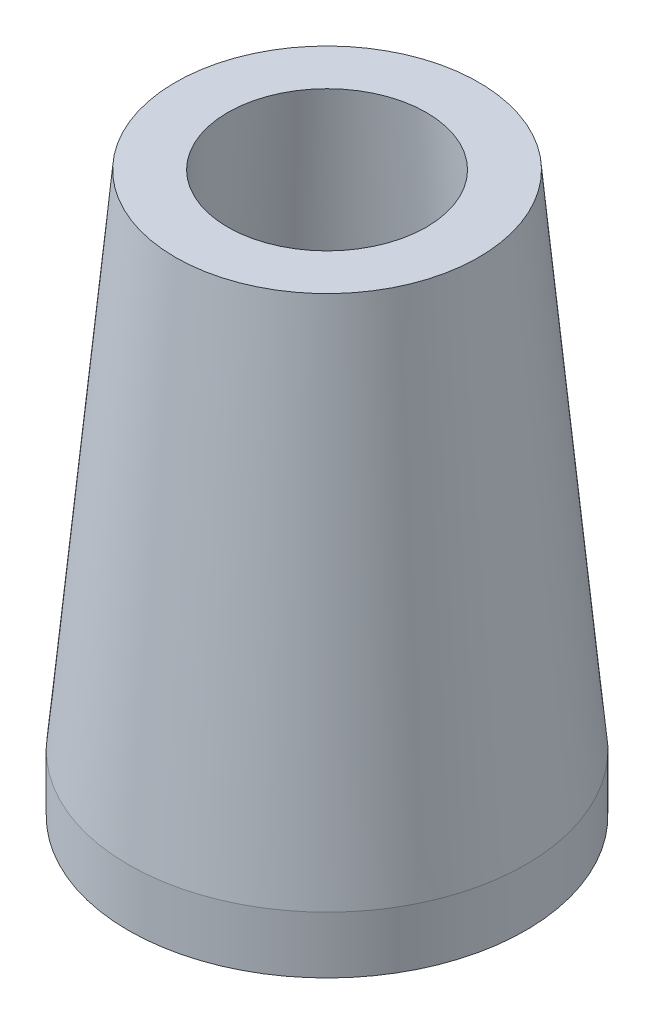
ISO-10303-21;
HEADER;
FILE_DESCRIPTION(('STEP AP214'),'2;1');
FILE_NAME('part.step','',(''),(''),'','','');
FILE_SCHEMA(('AUTOMOTIVE_DESIGN { 1 0 10303 214 1 1 1 1 }'));
ENDSEC;
DATA;
#1=APPLICATION_CONTEXT('core data for automotive mechanical design processes');
#2=APPLICATION_PROTOCOL_DEFINITION('international standard','automotive_design',2000,#1);
#3=PRODUCT_CONTEXT('',#1,'mechanical');
#4=PRODUCT('Part','Part','',(#3));
#5=PRODUCT_RELATED_PRODUCT_CATEGORY('part','',(#4));
#6=PRODUCT_DEFINITION_FORMATION('','',#4);
#7=PRODUCT_DEFINITION_CONTEXT('part definition',#1,'design');
#8=PRODUCT_DEFINITION('design','',#6,#7);
#9=PRODUCT_DEFINITION_SHAPE('','',#8);
#10=(LENGTH_UNIT() NAMED_UNIT(*) SI_UNIT(.MILLI.,.METRE.));
#11=(NAMED_UNIT(*) PLANE_ANGLE_UNIT() SI_UNIT($,.RADIAN.));
#12=(NAMED_UNIT(*) SI_UNIT($,.STERADIAN.) SOLID_ANGLE_UNIT());
#13=UNCERTAINTY_MEASURE_WITH_UNIT(LENGTH_MEASURE(1.E-05),#10,'distance_accuracy_value','');
#14=(GEOMETRIC_REPRESENTATION_CONTEXT(3) GLOBAL_UNCERTAINTY_ASSIGNED_CONTEXT((#13)) GLOBAL_UNIT_ASSIGNED_CONTEXT((#10,
#11,#12)) REPRESENTATION_CONTEXT('',''));
#15=CARTESIAN_POINT('',(0.,0.,0.));
#16=DIRECTION('',(0.,0.,1.));
#17=DIRECTION('',(1.,0.,0.));
#18=AXIS2_PLACEMENT_3D('',#15,#16,#17);
#19=CARTESIAN_POINT('',(452.999168680417,301.998778729753,0.));
#20=DIRECTION('',(0.,1.,0.));
#21=DIRECTION('',(0.,0.,1.));
#22=AXIS2_PLACEMENT_3D('',#19,#20,#21);
#23=PLANE('',#22);
#24=CARTESIAN_POINT('',(471.999750168189,301.998778729753,0.));
#25=DIRECTION('',(0.,1.,0.));
#26=DIRECTION('',(0.,0.,1.));
#27=AXIS2_PLACEMENT_3D('',#24,#25,#26);
#28=CIRCLE('',#27,29.0005814877719);
#29=CARTESIAN_POINT('',(471.999750168189,301.998778729753,29.0005814877719));
#30=VERTEX_POINT('',#29);
#31=EDGE_CURVE('E74',#30,#30,#28,.T.);
#32=ORIENTED_EDGE('',*,*,#31,.T.);
#33=EDGE_LOOP('',(#32));
#34=FACE_BOUND('',#33,.T.);
#35=CARTESIAN_POINT('',(471.999750168189,301.998778729753,0.));
#36=DIRECTION('',(0.,1.,0.));
#37=DIRECTION('',(0.,0.,1.));
#38=AXIS2_PLACEMENT_3D('',#35,#36,#37);
#39=CIRCLE('',#38,19.0005814877719);
#40=CARTESIAN_POINT('',(471.999750168189,301.998778729753,19.0005814877719));
#41=VERTEX_POINT('',#40);
#42=EDGE_CURVE('E10',#41,#41,#39,.T.);
#43=ORIENTED_EDGE('',*,*,#42,.F.);
#44=EDGE_LOOP('',(#43));
#45=FACE_BOUND('',#44,.T.);
#46=ADVANCED_FACE('F43',(#34,#45),#23,.T.);
#47=CARTESIAN_POINT('',(471.999750168189,301.998778729753,0.));
#48=DIRECTION('',(0.,-1.,0.));
#49=DIRECTION('',(0.,0.,-1.));
#50=AXIS2_PLACEMENT_3D('',#47,#48,#49);
#51=CONICAL_SURFACE('',#50,19.0005814877719,0.0739338318093924);
#52=CARTESIAN_POINT('',(471.999750168189,204.999945769809,0.));
#53=DIRECTION('',(0.,1.,0.));
#54=DIRECTION('',(0.,0.,1.));
#55=AXIS2_PLACEMENT_3D('',#52,#53,#54);
#56=CIRCLE('',#55,26.1851724938013);
#57=CARTESIAN_POINT('',(471.999750168189,204.999945769809,26.1851724938013));
#58=VERTEX_POINT('',#57);
#59=EDGE_CURVE('E50',#58,#58,#56,.T.);
#60=ORIENTED_EDGE('',*,*,#59,.F.);
#61=EDGE_LOOP('',(#60));
#62=FACE_BOUND('',#61,.T.);
#63=ORIENTED_EDGE('',*,*,#42,.T.);
#64=EDGE_LOOP('',(#63));
#65=FACE_BOUND('',#64,.T.);
#66=ADVANCED_FACE('F93',(#62,#65),#51,.F.);
#67=CARTESIAN_POINT('',(445.814577674387,204.999945769809,0.));
#68=DIRECTION('',(0.,1.,0.));
#69=DIRECTION('',(0.,0.,1.));
#70=AXIS2_PLACEMENT_3D('',#67,#68,#69);
#71=PLANE('',#70);
#72=CARTESIAN_POINT('',(471.999750168189,204.999945769809,0.));
#73=DIRECTION('',(0.,1.,0.));
#74=DIRECTION('',(0.,0.,1.));
#75=AXIS2_PLACEMENT_3D('',#72,#73,#74);
#76=CIRCLE('',#75,27.9815084844066);
#77=CARTESIAN_POINT('',(471.999750168189,204.999945769809,27.9815084844066));
#78=VERTEX_POINT('',#77);
#79=EDGE_CURVE('E55',#78,#78,#76,.T.);
#80=ORIENTED_EDGE('',*,*,#79,.F.);
#81=EDGE_LOOP('',(#80));
#82=FACE_BOUND('',#81,.T.);
#83=ORIENTED_EDGE('',*,*,#59,.T.);
#84=EDGE_LOOP('',(#83));
#85=FACE_BOUND('',#84,.T.);
#86=ADVANCED_FACE('F97',(#82,#85),#71,.F.);
#87=CARTESIAN_POINT('',(471.999750168189,301.998369033066,0.));
#88=DIRECTION('',(0.,1.,0.));
#89=DIRECTION('',(0.,0.,1.));
#90=AXIS2_PLACEMENT_3D('',#87,#88,#89);
#91=CYLINDRICAL_SURFACE('',#90,27.9815084844066);
#92=ORIENTED_EDGE('',*,*,#79,.T.);
#93=EDGE_LOOP('',(#92));
#94=FACE_BOUND('',#93,.T.);
#95=CARTESIAN_POINT('',(471.999750168189,194.999945769317,0.));
#96=DIRECTION('',(0.,1.,0.));
#97=DIRECTION('',(0.,0.,1.));
#98=AXIS2_PLACEMENT_3D('',#95,#96,#97);
#99=CIRCLE('',#98,27.9815084844066);
#100=CARTESIAN_POINT('',(471.999750168189,194.999945769317,27.9815084844066));
#101=VERTEX_POINT('',#100);
#102=EDGE_CURVE('E60',#101,#101,#99,.T.);
#103=ORIENTED_EDGE('',*,*,#102,.F.);
#104=EDGE_LOOP('',(#103));
#105=FACE_BOUND('',#104,.T.);
#106=ADVANCED_FACE('F102',(#94,#105),#91,.F.);
#107=CARTESIAN_POINT('',(434.018241683782,194.999945769317,0.));
#108=DIRECTION('',(0.,-1.,0.));
#109=DIRECTION('',(0.,0.,-1.));
#110=AXIS2_PLACEMENT_3D('',#107,#108,#109);
#111=PLANE('',#110);
#112=ORIENTED_EDGE('',*,*,#102,.T.);
#113=EDGE_LOOP('',(#112));
#114=FACE_BOUND('',#113,.T.);
#115=CARTESIAN_POINT('',(471.999750168189,194.999945769317,0.));
#116=DIRECTION('',(0.,1.,0.));
#117=DIRECTION('',(0.,0.,1.));
#118=AXIS2_PLACEMENT_3D('',#115,#116,#117);
#119=CIRCLE('',#118,37.9815084844066);
#120=CARTESIAN_POINT('',(471.999750168189,194.999945769317,37.9815084844066));
#121=VERTEX_POINT('',#120);
#122=EDGE_CURVE('E66',#121,#121,#119,.T.);
#123=ORIENTED_EDGE('',*,*,#122,.F.);
#124=EDGE_LOOP('',(#123));
#125=FACE_BOUND('',#124,.T.);
#126=ADVANCED_FACE('F89',(#114,#125),#111,.T.);
#127=CARTESIAN_POINT('',(471.999750168189,301.998369033066,0.));
#128=DIRECTION('',(0.,1.,0.));
#129=DIRECTION('',(0.,0.,1.));
#130=AXIS2_PLACEMENT_3D('',#127,#128,#129);
#131=CYLINDRICAL_SURFACE('',#130,37.9815084844066);
#132=CARTESIAN_POINT('',(471.999750168189,205.895851074525,0.));
#133=DIRECTION('',(0.,1.,0.));
#134=DIRECTION('',(0.,0.,1.));
#135=AXIS2_PLACEMENT_3D('',#132,#133,#134);
#136=CIRCLE('',#135,37.9815084844066);
#137=CARTESIAN_POINT('',(471.999750168189,205.895851074525,37.9815084844066));
#138=VERTEX_POINT('',#137);
#139=EDGE_CURVE('E70',#138,#138,#136,.T.);
#140=ORIENTED_EDGE('',*,*,#139,.F.);
#141=EDGE_LOOP('',(#140));
#142=FACE_BOUND('',#141,.T.);
#143=ORIENTED_EDGE('',*,*,#122,.T.);
#144=EDGE_LOOP('',(#143));
#145=FACE_BOUND('',#144,.T.);
#146=ADVANCED_FACE('F83',(#142,#145),#131,.T.);
#147=CARTESIAN_POINT('',(471.999750168189,301.998778729753,0.));
#148=DIRECTION('',(0.,-1.,0.));
#149=DIRECTION('',(0.,0.,-1.));
#150=AXIS2_PLACEMENT_3D('',#147,#148,#149);
#151=CONICAL_SURFACE('',#150,29.0005814877719,0.0931805048893345);
#152=ORIENTED_EDGE('',*,*,#139,.T.);
#153=EDGE_LOOP('',(#152));
#154=FACE_BOUND('',#153,.T.);
#155=ORIENTED_EDGE('',*,*,#31,.F.);
#156=EDGE_LOOP('',(#155));
#157=FACE_BOUND('',#156,.T.);
#158=ADVANCED_FACE('F81',(#154,#157),#151,.T.);
#159=CLOSED_SHELL('',(#46,#66,#86,#106,#126,#146,#158));
#160=MANIFOLD_SOLID_BREP('B2',#159);
#161=ADVANCED_BREP_SHAPE_REPRESENTATION('',(#18,#160),#14);
#162=SHAPE_DEFINITION_REPRESENTATION(#9,#161);
ENDSEC;
END-ISO-10303-21;
